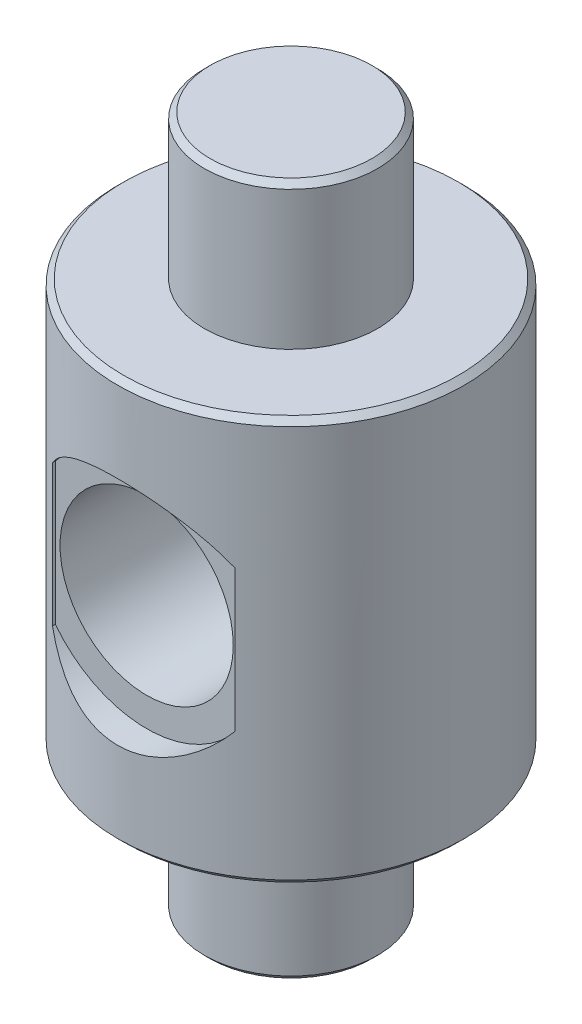
ISO-10303-21;
HEADER;
FILE_DESCRIPTION(('STEP AP214'),'2;1');
FILE_NAME('part.step','',(''),(''),'','','');
FILE_SCHEMA(('AUTOMOTIVE_DESIGN { 1 0 10303 214 1 1 1 1 }'));
ENDSEC;
DATA;
#1=APPLICATION_CONTEXT('core data for automotive mechanical design processes');
#2=APPLICATION_PROTOCOL_DEFINITION('international standard','automotive_design',2000,#1);
#3=PRODUCT_CONTEXT('',#1,'mechanical');
#4=PRODUCT('Part','Part','',(#3));
#5=PRODUCT_RELATED_PRODUCT_CATEGORY('part','',(#4));
#6=PRODUCT_DEFINITION_FORMATION('','',#4);
#7=PRODUCT_DEFINITION_CONTEXT('part definition',#1,'design');
#8=PRODUCT_DEFINITION('design','',#6,#7);
#9=PRODUCT_DEFINITION_SHAPE('','',#8);
#10=(LENGTH_UNIT() NAMED_UNIT(*) SI_UNIT(.MILLI.,.METRE.));
#11=(NAMED_UNIT(*) PLANE_ANGLE_UNIT() SI_UNIT($,.RADIAN.));
#12=(NAMED_UNIT(*) SI_UNIT($,.STERADIAN.) SOLID_ANGLE_UNIT());
#13=UNCERTAINTY_MEASURE_WITH_UNIT(LENGTH_MEASURE(1.E-05),#10,'distance_accuracy_value','');
#14=(GEOMETRIC_REPRESENTATION_CONTEXT(3) GLOBAL_UNCERTAINTY_ASSIGNED_CONTEXT((#13)) GLOBAL_UNIT_ASSIGNED_CONTEXT((#10,
#11,#12)) REPRESENTATION_CONTEXT('',''));
#15=CARTESIAN_POINT('',(0.,0.,0.));
#16=DIRECTION('',(0.,0.,1.));
#17=DIRECTION('',(1.,0.,0.));
#18=AXIS2_PLACEMENT_3D('',#15,#16,#17);
#19=CARTESIAN_POINT('',(0.,3.5,0.));
#20=DIRECTION('',(0.,-1.,0.));
#21=DIRECTION('',(0.,0.,-1.));
#22=AXIS2_PLACEMENT_3D('',#19,#20,#21);
#23=CYLINDRICAL_SURFACE('',#22,3.);
#24=CARTESIAN_POINT('',(0.,-3.4,0.));
#25=DIRECTION('',(0.,1.,0.));
#26=DIRECTION('',(0.,0.,1.));
#27=AXIS2_PLACEMENT_3D('',#24,#25,#26);
#28=CIRCLE('',#27,3.);
#29=CARTESIAN_POINT('',(0.,-3.4,3.));
#30=VERTEX_POINT('',#29);
#31=EDGE_CURVE('E222',#30,#30,#28,.T.);
#32=ORIENTED_EDGE('',*,*,#31,.T.);
#33=EDGE_LOOP('',(#32));
#34=FACE_BOUND('',#33,.T.);
#35=CARTESIAN_POINT('',(0.,3.4,0.));
#36=DIRECTION('',(0.,1.,0.));
#37=DIRECTION('',(0.,0.,1.));
#38=AXIS2_PLACEMENT_3D('',#35,#36,#37);
#39=CIRCLE('',#38,3.);
#40=CARTESIAN_POINT('',(0.,3.4,-3.));
#41=VERTEX_POINT('',#40);
#42=EDGE_CURVE('E226',#41,#41,#39,.F.);
#43=ORIENTED_EDGE('',*,*,#42,.T.);
#44=EDGE_LOOP('',(#43));
#45=FACE_BOUND('',#44,.T.);
#46=DIRECTION('',(0.,-1.,0.));
#47=VECTOR('',#46,1.);
#48=CARTESIAN_POINT('',(1.58145700431185,3.5,2.549312406025));
#49=LINE('',#48,#47);
#50=CARTESIAN_POINT('',(1.58145700431185,-1.22433399998243,2.549312406025));
#51=VERTEX_POINT('',#50);
#52=CARTESIAN_POINT('',(1.58145700431185,1.22433399998243,2.549312406025));
#53=VERTEX_POINT('',#52);
#54=EDGE_CURVE('E229',#51,#53,#49,.F.);
#55=ORIENTED_EDGE('',*,*,#54,.F.);
#56=CARTESIAN_POINT('',(1.58145700431185,-1.22433399998243,2.549312406025));
#57=CARTESIAN_POINT('',(1.54682556850329,-1.26905046882896,2.57079701537952));
#58=CARTESIAN_POINT('',(1.51036667300085,-1.31223999737416,2.59243482445627));
#59=CARTESIAN_POINT('',(1.43385097178377,-1.39544951103376,2.63552677301982));
#60=CARTESIAN_POINT('',(1.39379234019112,-1.43546786806224,2.65698081318248));
#61=CARTESIAN_POINT('',(1.26772958957034,-1.55110300532381,2.72061528811525));
#62=CARTESIAN_POINT('',(1.17636152917721,-1.621622564197,2.76172967014148));
#63=CARTESIAN_POINT('',(0.980393904844763,-1.74711699185225,2.8372350745841));
#64=CARTESIAN_POINT('',(0.875742974165186,-1.80202867904471,2.8715986006667));
#65=CARTESIAN_POINT('',(0.656114969860568,-1.89302366683344,2.92955747969777));
#66=CARTESIAN_POINT('',(0.541180189702668,-1.92918027229269,2.95319471065037));
#67=CARTESIAN_POINT('',(0.319544611235103,-1.97714507948052,2.98476540223795));
#68=CARTESIAN_POINT('',(0.213607755014206,-1.99142989158149,2.99429122726524));
#69=CARTESIAN_POINT('',(0.000355158746854033,-2.00284349309578,3.00189254845444));
#70=CARTESIAN_POINT('',(-0.106960590231578,-1.9999721713218,2.99996797040736));
#71=CARTESIAN_POINT('',(-0.306607543469042,-1.97860892479117,2.98577379457322));
#72=CARTESIAN_POINT('',(-0.399234818191251,-1.96196449176591,2.97472803914838));
#73=CARTESIAN_POINT('',(-0.580023446107977,-1.91631518510482,2.94482036019719));
#74=CARTESIAN_POINT('',(-0.668185383323556,-1.88731193257282,2.92595946179051));
#75=CARTESIAN_POINT('',(-0.842006529158818,-1.81665046952535,2.88087582193554));
#76=CARTESIAN_POINT('',(-0.927385539624844,-1.77449218566186,2.85436600964876));
#77=CARTESIAN_POINT('',(-1.09011912785783,-1.67944396554604,2.7962689052233));
#78=CARTESIAN_POINT('',(-1.16746558239865,-1.62654332237177,2.76467655389042));
#79=CARTESIAN_POINT('',(-1.3044076906707,-1.51828831679458,2.70249251907458));
#80=CARTESIAN_POINT('',(-1.36501856698581,-1.46400840104752,2.67224361772993));
#81=CARTESIAN_POINT('',(-1.47881198662576,-1.34893099262961,2.61099664236225));
#82=CARTESIAN_POINT('',(-1.53201871176459,-1.28815592056273,2.58000141443293));
#83=CARTESIAN_POINT('',(-1.58145700431185,-1.22433399998243,2.549312406025));
#84=B_SPLINE_CURVE_WITH_KNOTS('',3,(#56,#57,#58,#59,#60,#61,#62,#63,#64,#65,#66,#67,#68,#69,#70,
#71,#72,#73,#74,#75,#76,#77,#78,#79,#80,#81,#82,#83),.UNSPECIFIED.,.F.,.F.,(4,2,2,2,2,2,2,2,2,2,
2,2,2,4),(0.,0.181401404479696,0.36289534541761,0.728612432608602,1.09578953921052,
1.46152049800956,1.78158268736794,2.10164695102162,2.38464536514129,2.66760666983787,
2.96300162348525,3.25869245559962,3.51854604156222,3.77752996523963),.UNSPECIFIED.);
#85=CARTESIAN_POINT('',(-1.58145700431185,-1.22433399998243,2.549312406025));
#86=VERTEX_POINT('',#85);
#87=EDGE_CURVE('E162',#51,#86,#84,.T.);
#88=ORIENTED_EDGE('',*,*,#87,.T.);
#89=DIRECTION('',(0.,-1.,0.));
#90=VECTOR('',#89,1.);
#91=CARTESIAN_POINT('',(-1.58145700431185,3.5,2.549312406025));
#92=LINE('',#91,#90);
#93=CARTESIAN_POINT('',(-1.58145700431185,1.22433399998243,2.549312406025));
#94=VERTEX_POINT('',#93);
#95=EDGE_CURVE('E284',#86,#94,#92,.F.);
#96=ORIENTED_EDGE('',*,*,#95,.T.);
#97=CARTESIAN_POINT('',(-1.58145700431185,1.22433399998243,2.549312406025));
#98=CARTESIAN_POINT('',(-1.54682556850329,1.26905046882896,2.57079701537952));
#99=CARTESIAN_POINT('',(-1.51036667300085,1.31223999737416,2.59243482445627));
#100=CARTESIAN_POINT('',(-1.43385097178377,1.39544951103376,2.63552677301982));
#101=CARTESIAN_POINT('',(-1.39379234019112,1.43546786806224,2.65698081318248));
#102=CARTESIAN_POINT('',(-1.26772958957034,1.55110300532381,2.72061528811525));
#103=CARTESIAN_POINT('',(-1.17636152917721,1.621622564197,2.76172967014148));
#104=CARTESIAN_POINT('',(-0.980393904844763,1.74711699185225,2.8372350745841));
#105=CARTESIAN_POINT('',(-0.875742974165186,1.80202867904471,2.8715986006667));
#106=CARTESIAN_POINT('',(-0.656114969860568,1.89302366683344,2.92955747969777));
#107=CARTESIAN_POINT('',(-0.541180189702668,1.92918027229269,2.95319471065037));
#108=CARTESIAN_POINT('',(-0.319544611235103,1.97714507948052,2.98476540223795));
#109=CARTESIAN_POINT('',(-0.213607755014206,1.99142989158149,2.99429122726524));
#110=CARTESIAN_POINT('',(-0.000355158746853938,2.00284349309578,3.00189254845444));
#111=CARTESIAN_POINT('',(0.106960590231578,1.9999721713218,2.99996797040736));
#112=CARTESIAN_POINT('',(0.306607543469042,1.97860892479117,2.98577379457322));
#113=CARTESIAN_POINT('',(0.399234818191251,1.96196449176591,2.97472803914838));
#114=CARTESIAN_POINT('',(0.580023446107977,1.91631518510482,2.94482036019719));
#115=CARTESIAN_POINT('',(0.668185383323556,1.88731193257282,2.92595946179051));
#116=CARTESIAN_POINT('',(0.842006529158818,1.81665046952535,2.88087582193554));
#117=CARTESIAN_POINT('',(0.927385539624844,1.77449218566186,2.85436600964876));
#118=CARTESIAN_POINT('',(1.09011912785783,1.67944396554604,2.7962689052233));
#119=CARTESIAN_POINT('',(1.16746558239865,1.62654332237177,2.76467655389042));
#120=CARTESIAN_POINT('',(1.3044076906707,1.51828831679458,2.70249251907458));
#121=CARTESIAN_POINT('',(1.36501856698581,1.46400840104752,2.67224361772993));
#122=CARTESIAN_POINT('',(1.47881198662576,1.34893099262961,2.61099664236225));
#123=CARTESIAN_POINT('',(1.53201871176459,1.28815592056273,2.58000141443293));
#124=CARTESIAN_POINT('',(1.58145700431185,1.22433399998243,2.549312406025));
#125=B_SPLINE_CURVE_WITH_KNOTS('',3,(#97,#98,#99,#100,#101,#102,#103,#104,#105,#106,#107,#108,
#109,#110,#111,#112,#113,#114,#115,#116,#117,#118,#119,#120,#121,#122,#123,#124),.UNSPECIFIED.,
.F.,.F.,(4,2,2,2,2,2,2,2,2,2,2,2,2,4),(0.,0.181401404479696,0.36289534541761,0.728612432608602,
1.09578953921052,1.46152049800956,1.78158268736794,2.10164695102162,2.38464536514129,
2.66760666983787,2.96300162348525,3.25869245559961,3.51854604156222,3.77752996523963),.UNSPECIFIED.);
#126=EDGE_CURVE('E59',#94,#53,#125,.T.);
#127=ORIENTED_EDGE('',*,*,#126,.T.);
#128=EDGE_LOOP('',(#55,#88,#96,#127));
#129=FACE_BOUND('',#128,.T.);
#130=CARTESIAN_POINT('',(1.58145700431185,-1.22433399998243,-2.549312406025));
#131=CARTESIAN_POINT('',(1.5468255685033,-1.26905046882896,-2.57079701537952));
#132=CARTESIAN_POINT('',(1.51036667300085,-1.31223999737416,-2.59243482445627));
#133=CARTESIAN_POINT('',(1.43385097178377,-1.39544951103375,-2.63552677301982));
#134=CARTESIAN_POINT('',(1.39379234019112,-1.43546786806224,-2.65698081318248));
#135=CARTESIAN_POINT('',(1.26772958957034,-1.55110300532381,-2.72061528811525));
#136=CARTESIAN_POINT('',(1.17636152917721,-1.621622564197,-2.76172967014148));
#137=CARTESIAN_POINT('',(0.980393904844763,-1.74711699185225,-2.8372350745841));
#138=CARTESIAN_POINT('',(0.875742974165186,-1.80202867904471,-2.8715986006667));
#139=CARTESIAN_POINT('',(0.656114969860568,-1.89302366683344,-2.92955747969777));
#140=CARTESIAN_POINT('',(0.541180189702669,-1.92918027229269,-2.95319471065037));
#141=CARTESIAN_POINT('',(0.319544611235103,-1.97714507948052,-2.98476540223795));
#142=CARTESIAN_POINT('',(0.213607755014206,-1.99142989158149,-2.99429122726524));
#143=CARTESIAN_POINT('',(0.000355158746854603,-2.00284349309578,-3.00189254845444));
#144=CARTESIAN_POINT('',(-0.106960590231577,-1.9999721713218,-2.99996797040736));
#145=CARTESIAN_POINT('',(-0.306607543469041,-1.97860892479117,-2.98577379457322));
#146=CARTESIAN_POINT('',(-0.39923481819125,-1.96196449176591,-2.97472803914838));
#147=CARTESIAN_POINT('',(-0.580023446107976,-1.91631518510482,-2.9448203601972));
#148=CARTESIAN_POINT('',(-0.668185383323555,-1.88731193257282,-2.92595946179051));
#149=CARTESIAN_POINT('',(-0.842006529158818,-1.81665046952535,-2.88087582193554));
#150=CARTESIAN_POINT('',(-0.927385539624844,-1.77449218566186,-2.85436600964876));
#151=CARTESIAN_POINT('',(-1.09011912785783,-1.67944396554604,-2.7962689052233));
#152=CARTESIAN_POINT('',(-1.16746558239865,-1.62654332237177,-2.76467655389042));
#153=CARTESIAN_POINT('',(-1.3044076906707,-1.51828831679458,-2.70249251907458));
#154=CARTESIAN_POINT('',(-1.36501856698581,-1.46400840104752,-2.67224361772993));
#155=CARTESIAN_POINT('',(-1.47881198662576,-1.34893099262961,-2.61099664236225));
#156=CARTESIAN_POINT('',(-1.53201871176459,-1.28815592056273,-2.58000141443293));
#157=CARTESIAN_POINT('',(-1.58145700431185,-1.22433399998243,-2.549312406025));
#158=B_SPLINE_CURVE_WITH_KNOTS('',3,(#130,#131,#132,#133,#134,#135,#136,#137,#138,#139,#140,
#141,#142,#143,#144,#145,#146,#147,#148,#149,#150,#151,#152,#153,#154,#155,#156,#157),
.UNSPECIFIED.,.F.,.F.,(4,2,2,2,2,2,2,2,2,2,2,2,2,4),(0.,0.181401404479696,0.36289534541761,
0.728612432608602,1.09578953921052,1.46152049800956,1.78158268736794,2.10164695102162,
2.38464536514129,2.66760666983787,2.96300162348525,3.25869245559962,3.51854604156222,
3.77752996523963),.UNSPECIFIED.);
#159=CARTESIAN_POINT('',(1.58145700431185,-1.22433399998243,-2.549312406025));
#160=VERTEX_POINT('',#159);
#161=CARTESIAN_POINT('',(-1.58145700431185,-1.22433399998243,-2.549312406025));
#162=VERTEX_POINT('',#161);
#163=EDGE_CURVE('E231',#160,#162,#158,.T.);
#164=ORIENTED_EDGE('',*,*,#163,.F.);
#165=DIRECTION('',(0.,-1.,0.));
#166=VECTOR('',#165,1.);
#167=CARTESIAN_POINT('',(1.58145700431185,3.5,-2.549312406025));
#168=LINE('',#167,#166);
#169=CARTESIAN_POINT('',(1.58145700431185,1.22433399998243,-2.549312406025));
#170=VERTEX_POINT('',#169);
#171=EDGE_CURVE('E233',#160,#170,#168,.F.);
#172=ORIENTED_EDGE('',*,*,#171,.T.);
#173=CARTESIAN_POINT('',(-1.58145700431185,1.22433399998243,-2.549312406025));
#174=CARTESIAN_POINT('',(-1.54682556850329,1.26905046882896,-2.57079701537952));
#175=CARTESIAN_POINT('',(-1.51036667300085,1.31223999737416,-2.59243482445627));
#176=CARTESIAN_POINT('',(-1.43385097178377,1.39544951103376,-2.63552677301982));
#177=CARTESIAN_POINT('',(-1.39379234019112,1.43546786806224,-2.65698081318248));
#178=CARTESIAN_POINT('',(-1.26772958957034,1.55110300532381,-2.72061528811525));
#179=CARTESIAN_POINT('',(-1.17636152917721,1.621622564197,-2.76172967014148));
#180=CARTESIAN_POINT('',(-0.980393904844763,1.74711699185225,-2.8372350745841));
#181=CARTESIAN_POINT('',(-0.875742974165186,1.80202867904471,-2.8715986006667));
#182=CARTESIAN_POINT('',(-0.656114969860568,1.89302366683344,-2.92955747969777));
#183=CARTESIAN_POINT('',(-0.541180189702668,1.92918027229269,-2.95319471065037));
#184=CARTESIAN_POINT('',(-0.319544611235103,1.97714507948052,-2.98476540223795));
#185=CARTESIAN_POINT('',(-0.213607755014206,1.99142989158149,-2.99429122726524));
#186=CARTESIAN_POINT('',(-0.000355158746853938,2.00284349309578,-3.00189254845444));
#187=CARTESIAN_POINT('',(0.106960590231578,1.9999721713218,-2.99996797040736));
#188=CARTESIAN_POINT('',(0.306607543469042,1.97860892479117,-2.98577379457322));
#189=CARTESIAN_POINT('',(0.399234818191251,1.96196449176591,-2.97472803914838));
#190=CARTESIAN_POINT('',(0.580023446107977,1.91631518510482,-2.94482036019719));
#191=CARTESIAN_POINT('',(0.668185383323556,1.88731193257282,-2.92595946179051));
#192=CARTESIAN_POINT('',(0.842006529158818,1.81665046952535,-2.88087582193554));
#193=CARTESIAN_POINT('',(0.927385539624844,1.77449218566186,-2.85436600964876));
#194=CARTESIAN_POINT('',(1.09011912785783,1.67944396554604,-2.7962689052233));
#195=CARTESIAN_POINT('',(1.16746558239865,1.62654332237177,-2.76467655389042));
#196=CARTESIAN_POINT('',(1.3044076906707,1.51828831679458,-2.70249251907458));
#197=CARTESIAN_POINT('',(1.36501856698581,1.46400840104752,-2.67224361772993));
#198=CARTESIAN_POINT('',(1.47881198662576,1.34893099262961,-2.61099664236225));
#199=CARTESIAN_POINT('',(1.53201871176459,1.28815592056273,-2.58000141443293));
#200=CARTESIAN_POINT('',(1.58145700431185,1.22433399998243,-2.549312406025));
#201=B_SPLINE_CURVE_WITH_KNOTS('',3,(#173,#174,#175,#176,#177,#178,#179,#180,#181,#182,#183,
#184,#185,#186,#187,#188,#189,#190,#191,#192,#193,#194,#195,#196,#197,#198,#199,#200),
.UNSPECIFIED.,.F.,.F.,(4,2,2,2,2,2,2,2,2,2,2,2,2,4),(0.,0.181401404479696,0.36289534541761,
0.728612432608602,1.09578953921052,1.46152049800956,1.78158268736794,2.10164695102162,
2.38464536514129,2.66760666983787,2.96300162348525,3.25869245559961,3.51854604156222,
3.77752996523963),.UNSPECIFIED.);
#202=CARTESIAN_POINT('',(-1.58145700431185,1.22433399998243,-2.549312406025));
#203=VERTEX_POINT('',#202);
#204=EDGE_CURVE('E240',#203,#170,#201,.T.);
#205=ORIENTED_EDGE('',*,*,#204,.F.);
#206=DIRECTION('',(0.,-1.,0.));
#207=VECTOR('',#206,1.);
#208=CARTESIAN_POINT('',(-1.58145700431185,3.5,-2.549312406025));
#209=LINE('',#208,#207);
#210=EDGE_CURVE('E122',#162,#203,#209,.F.);
#211=ORIENTED_EDGE('',*,*,#210,.F.);
#212=EDGE_LOOP('',(#164,#172,#205,#211));
#213=FACE_BOUND('',#212,.T.);
#214=ADVANCED_FACE('F35',(#34,#45,#129,#213),#23,.T.);
#215=CARTESIAN_POINT('',(0.,0.,-3.));
#216=DIRECTION('',(0.,0.,1.));
#217=DIRECTION('',(1.,0.,0.));
#218=AXIS2_PLACEMENT_3D('',#215,#216,#217);
#219=CYLINDRICAL_SURFACE('',#218,1.5);
#220=CARTESIAN_POINT('',(0.,0.,2.5));
#221=DIRECTION('',(0.,0.,1.));
#222=DIRECTION('',(1.,0.,0.));
#223=AXIS2_PLACEMENT_3D('',#220,#221,#222);
#224=CIRCLE('',#223,1.5);
#225=CARTESIAN_POINT('',(1.5,0.,2.5));
#226=VERTEX_POINT('',#225);
#227=EDGE_CURVE('E142',#226,#226,#224,.T.);
#228=ORIENTED_EDGE('',*,*,#227,.T.);
#229=EDGE_LOOP('',(#228));
#230=FACE_BOUND('',#229,.T.);
#231=CARTESIAN_POINT('',(0.,0.,-2.5));
#232=DIRECTION('',(0.,0.,-1.));
#233=DIRECTION('',(-1.,0.,0.));
#234=AXIS2_PLACEMENT_3D('',#231,#232,#233);
#235=CIRCLE('',#234,1.5);
#236=CARTESIAN_POINT('',(-1.5,0.,-2.5));
#237=VERTEX_POINT('',#236);
#238=EDGE_CURVE('E133',#237,#237,#235,.F.);
#239=ORIENTED_EDGE('',*,*,#238,.F.);
#240=EDGE_LOOP('',(#239));
#241=FACE_BOUND('',#240,.T.);
#242=ADVANCED_FACE('F211',(#230,#241),#219,.F.);
#243=CARTESIAN_POINT('',(0.,6.,0.));
#244=DIRECTION('',(0.,-1.,0.));
#245=DIRECTION('',(0.,0.,-1.));
#246=AXIS2_PLACEMENT_3D('',#243,#244,#245);
#247=CYLINDRICAL_SURFACE('',#246,1.5);
#248=CARTESIAN_POINT('',(0.,5.9,0.));
#249=DIRECTION('',(0.,1.,0.));
#250=DIRECTION('',(0.,0.,1.));
#251=AXIS2_PLACEMENT_3D('',#248,#249,#250);
#252=CIRCLE('',#251,1.5);
#253=CARTESIAN_POINT('',(0.,5.9,1.5));
#254=VERTEX_POINT('',#253);
#255=EDGE_CURVE('E334',#254,#254,#252,.F.);
#256=ORIENTED_EDGE('',*,*,#255,.T.);
#257=EDGE_LOOP('',(#256));
#258=FACE_BOUND('',#257,.T.);
#259=CARTESIAN_POINT('',(0.,3.5,0.));
#260=DIRECTION('',(0.,1.,0.));
#261=DIRECTION('',(0.,0.,1.));
#262=AXIS2_PLACEMENT_3D('',#259,#260,#261);
#263=CIRCLE('',#262,1.5);
#264=CARTESIAN_POINT('',(0.,3.5,1.5));
#265=VERTEX_POINT('',#264);
#266=EDGE_CURVE('E152',#265,#265,#263,.T.);
#267=ORIENTED_EDGE('',*,*,#266,.T.);
#268=EDGE_LOOP('',(#267));
#269=FACE_BOUND('',#268,.T.);
#270=ADVANCED_FACE('F216',(#258,#269),#247,.T.);
#271=CARTESIAN_POINT('',(0.,6.,0.));
#272=DIRECTION('',(0.,1.,0.));
#273=DIRECTION('',(0.,0.,1.));
#274=AXIS2_PLACEMENT_3D('',#271,#272,#273);
#275=PLANE('',#274);
#276=CARTESIAN_POINT('',(0.,6.,0.));
#277=DIRECTION('',(0.,1.,0.));
#278=DIRECTION('',(0.,0.,1.));
#279=AXIS2_PLACEMENT_3D('',#276,#277,#278);
#280=CIRCLE('',#279,1.4);
#281=CARTESIAN_POINT('',(0.,6.,1.4));
#282=VERTEX_POINT('',#281);
#283=EDGE_CURVE('E239',#282,#282,#280,.T.);
#284=ORIENTED_EDGE('',*,*,#283,.T.);
#285=EDGE_LOOP('',(#284));
#286=FACE_BOUND('',#285,.T.);
#287=ADVANCED_FACE('F198',(#286),#275,.T.);
#288=CARTESIAN_POINT('',(0.,3.5,0.));
#289=DIRECTION('',(0.,1.,0.));
#290=DIRECTION('',(0.,0.,1.));
#291=AXIS2_PLACEMENT_3D('',#288,#289,#290);
#292=PLANE('',#291);
#293=CARTESIAN_POINT('',(0.,3.5,0.));
#294=DIRECTION('',(0.,1.,0.));
#295=DIRECTION('',(0.,0.,1.));
#296=AXIS2_PLACEMENT_3D('',#293,#294,#295);
#297=CIRCLE('',#296,2.9);
#298=CARTESIAN_POINT('',(0.,3.5,-2.9));
#299=VERTEX_POINT('',#298);
#300=EDGE_CURVE('E11',#299,#299,#297,.T.);
#301=ORIENTED_EDGE('',*,*,#300,.T.);
#302=EDGE_LOOP('',(#301));
#303=FACE_BOUND('',#302,.T.);
#304=ORIENTED_EDGE('',*,*,#266,.F.);
#305=EDGE_LOOP('',(#304));
#306=FACE_BOUND('',#305,.T.);
#307=ADVANCED_FACE('F195',(#303,#306),#292,.T.);
#308=CARTESIAN_POINT('',(0.,-3.5,0.));
#309=DIRECTION('',(0.,1.,0.));
#310=DIRECTION('',(0.,0.,1.));
#311=AXIS2_PLACEMENT_3D('',#308,#309,#310);
#312=PLANE('',#311);
#313=CARTESIAN_POINT('',(0.,-3.5,0.));
#314=DIRECTION('',(0.,1.,0.));
#315=DIRECTION('',(0.,0.,1.));
#316=AXIS2_PLACEMENT_3D('',#313,#314,#315);
#317=CIRCLE('',#316,2.9);
#318=CARTESIAN_POINT('',(0.,-3.5,2.9));
#319=VERTEX_POINT('',#318);
#320=EDGE_CURVE('E44',#319,#319,#317,.F.);
#321=ORIENTED_EDGE('',*,*,#320,.T.);
#322=EDGE_LOOP('',(#321));
#323=FACE_BOUND('',#322,.T.);
#324=CARTESIAN_POINT('',(0.,-3.5,0.));
#325=DIRECTION('',(0.,1.,0.));
#326=DIRECTION('',(0.,0.,1.));
#327=AXIS2_PLACEMENT_3D('',#324,#325,#326);
#328=CIRCLE('',#327,1.5);
#329=CARTESIAN_POINT('',(0.,-3.5,1.5));
#330=VERTEX_POINT('',#329);
#331=EDGE_CURVE('E159',#330,#330,#328,.T.);
#332=ORIENTED_EDGE('',*,*,#331,.T.);
#333=EDGE_LOOP('',(#332));
#334=FACE_BOUND('',#333,.T.);
#335=ADVANCED_FACE('F197',(#323,#334),#312,.F.);
#336=CARTESIAN_POINT('',(0.,-6.,0.));
#337=DIRECTION('',(0.,1.,0.));
#338=DIRECTION('',(0.,0.,1.));
#339=AXIS2_PLACEMENT_3D('',#336,#337,#338);
#340=PLANE('',#339);
#341=CARTESIAN_POINT('',(0.,-6.,0.));
#342=DIRECTION('',(0.,1.,0.));
#343=DIRECTION('',(0.,0.,1.));
#344=AXIS2_PLACEMENT_3D('',#341,#342,#343);
#345=CIRCLE('',#344,1.4);
#346=CARTESIAN_POINT('',(0.,-6.,1.4));
#347=VERTEX_POINT('',#346);
#348=EDGE_CURVE('E326',#347,#347,#345,.F.);
#349=ORIENTED_EDGE('',*,*,#348,.T.);
#350=EDGE_LOOP('',(#349));
#351=FACE_BOUND('',#350,.T.);
#352=ADVANCED_FACE('F201',(#351),#340,.F.);
#353=CARTESIAN_POINT('',(0.,-5.9,0.));
#354=DIRECTION('',(0.,1.,0.));
#355=DIRECTION('',(0.,0.,1.));
#356=AXIS2_PLACEMENT_3D('',#353,#354,#355);
#357=CIRCLE('',#356,1.5);
#358=CARTESIAN_POINT('',(0.,-5.9,1.5));
#359=VERTEX_POINT('',#358);
#360=EDGE_CURVE('E331',#359,#359,#357,.T.);
#361=ORIENTED_EDGE('',*,*,#360,.T.);
#362=EDGE_LOOP('',(#361));
#363=FACE_BOUND('',#362,.T.);
#364=ORIENTED_EDGE('',*,*,#331,.F.);
#365=EDGE_LOOP('',(#364));
#366=FACE_BOUND('',#365,.T.);
#367=ADVANCED_FACE('F193',(#363,#366),#247,.T.);
#368=CARTESIAN_POINT('',(-1.58145700431185,1.22433399998243,2.5));
#369=DIRECTION('',(-1.,0.,0.));
#370=DIRECTION('',(0.,0.,1.));
#371=AXIS2_PLACEMENT_3D('',#368,#369,#370);
#372=PLANE('',#371);
#373=DIRECTION('',(0.,0.,1.));
#374=VECTOR('',#373,1.);
#375=CARTESIAN_POINT('',(-1.58145700431185,-1.22433399998243,2.5));
#376=LINE('',#375,#374);
#377=CARTESIAN_POINT('',(-1.58145700431185,-1.22433399998243,2.5));
#378=VERTEX_POINT('',#377);
#379=EDGE_CURVE('E51',#378,#86,#376,.T.);
#380=ORIENTED_EDGE('',*,*,#379,.F.);
#381=DIRECTION('',(0.,-1.,0.));
#382=VECTOR('',#381,1.);
#383=CARTESIAN_POINT('',(-1.58145700431185,1.22433399998243,2.5));
#384=LINE('',#383,#382);
#385=CARTESIAN_POINT('',(-1.58145700431185,1.22433399998243,2.5));
#386=VERTEX_POINT('',#385);
#387=EDGE_CURVE('E138',#386,#378,#384,.T.);
#388=ORIENTED_EDGE('',*,*,#387,.F.);
#389=DIRECTION('',(0.,0.,1.));
#390=VECTOR('',#389,1.);
#391=CARTESIAN_POINT('',(-1.58145700431185,1.22433399998243,2.5));
#392=LINE('',#391,#390);
#393=EDGE_CURVE('E150',#386,#94,#392,.T.);
#394=ORIENTED_EDGE('',*,*,#393,.T.);
#395=ORIENTED_EDGE('',*,*,#95,.F.);
#396=EDGE_LOOP('',(#380,#388,#394,#395));
#397=FACE_BOUND('',#396,.T.);
#398=ADVANCED_FACE('F189',(#397),#372,.F.);
#399=CARTESIAN_POINT('',(0.,0.,2.5));
#400=DIRECTION('',(0.,0.,1.));
#401=DIRECTION('',(1.,0.,0.));
#402=AXIS2_PLACEMENT_3D('',#399,#400,#401);
#403=CYLINDRICAL_SURFACE('',#402,2.);
#404=ORIENTED_EDGE('',*,*,#393,.F.);
#405=CARTESIAN_POINT('',(0.,0.,2.5));
#406=DIRECTION('',(0.,0.,1.));
#407=DIRECTION('',(1.,0.,0.));
#408=AXIS2_PLACEMENT_3D('',#405,#406,#407);
#409=CIRCLE('',#408,2.);
#410=CARTESIAN_POINT('',(1.58145700431185,1.22433399998243,2.5));
#411=VERTEX_POINT('',#410);
#412=EDGE_CURVE('E147',#411,#386,#409,.T.);
#413=ORIENTED_EDGE('',*,*,#412,.F.);
#414=DIRECTION('',(0.,0.,1.));
#415=VECTOR('',#414,1.);
#416=CARTESIAN_POINT('',(1.58145700431185,1.22433399998243,2.5));
#417=LINE('',#416,#415);
#418=EDGE_CURVE('E153',#411,#53,#417,.T.);
#419=ORIENTED_EDGE('',*,*,#418,.T.);
#420=ORIENTED_EDGE('',*,*,#126,.F.);
#421=EDGE_LOOP('',(#404,#413,#419,#420));
#422=FACE_BOUND('',#421,.T.);
#423=ADVANCED_FACE('F192',(#422),#403,.F.);
#424=CARTESIAN_POINT('',(1.58145700431185,1.22433399998243,2.5));
#425=DIRECTION('',(-1.,0.,0.));
#426=DIRECTION('',(0.,0.,1.));
#427=AXIS2_PLACEMENT_3D('',#424,#425,#426);
#428=PLANE('',#427);
#429=ORIENTED_EDGE('',*,*,#54,.T.);
#430=ORIENTED_EDGE('',*,*,#418,.F.);
#431=DIRECTION('',(0.,-1.,0.));
#432=VECTOR('',#431,1.);
#433=CARTESIAN_POINT('',(1.58145700431185,1.22433399998243,2.5));
#434=LINE('',#433,#432);
#435=CARTESIAN_POINT('',(1.58145700431185,-1.22433399998243,2.5));
#436=VERTEX_POINT('',#435);
#437=EDGE_CURVE('E145',#411,#436,#434,.T.);
#438=ORIENTED_EDGE('',*,*,#437,.T.);
#439=DIRECTION('',(0.,0.,1.));
#440=VECTOR('',#439,1.);
#441=CARTESIAN_POINT('',(1.58145700431185,-1.22433399998243,2.5));
#442=LINE('',#441,#440);
#443=EDGE_CURVE('E155',#436,#51,#442,.T.);
#444=ORIENTED_EDGE('',*,*,#443,.T.);
#445=EDGE_LOOP('',(#429,#430,#438,#444));
#446=FACE_BOUND('',#445,.T.);
#447=ADVANCED_FACE('F188',(#446),#428,.T.);
#448=CARTESIAN_POINT('',(0.,0.,2.5));
#449=DIRECTION('',(0.,0.,1.));
#450=DIRECTION('',(1.,0.,0.));
#451=AXIS2_PLACEMENT_3D('',#448,#449,#450);
#452=CYLINDRICAL_SURFACE('',#451,2.);
#453=ORIENTED_EDGE('',*,*,#443,.F.);
#454=CARTESIAN_POINT('',(0.,0.,2.5));
#455=DIRECTION('',(0.,0.,1.));
#456=DIRECTION('',(1.,0.,0.));
#457=AXIS2_PLACEMENT_3D('',#454,#455,#456);
#458=CIRCLE('',#457,2.);
#459=EDGE_CURVE('E141',#378,#436,#458,.T.);
#460=ORIENTED_EDGE('',*,*,#459,.F.);
#461=ORIENTED_EDGE('',*,*,#379,.T.);
#462=ORIENTED_EDGE('',*,*,#87,.F.);
#463=EDGE_LOOP('',(#453,#460,#461,#462));
#464=FACE_BOUND('',#463,.T.);
#465=ADVANCED_FACE('F182',(#464),#452,.F.);
#466=CARTESIAN_POINT('',(0.,0.,2.5));
#467=DIRECTION('',(0.,0.,1.));
#468=DIRECTION('',(1.,0.,0.));
#469=AXIS2_PLACEMENT_3D('',#466,#467,#468);
#470=PLANE('',#469);
#471=ORIENTED_EDGE('',*,*,#227,.F.);
#472=EDGE_LOOP('',(#471));
#473=FACE_BOUND('',#472,.T.);
#474=ORIENTED_EDGE('',*,*,#387,.T.);
#475=ORIENTED_EDGE('',*,*,#459,.T.);
#476=ORIENTED_EDGE('',*,*,#437,.F.);
#477=ORIENTED_EDGE('',*,*,#412,.T.);
#478=EDGE_LOOP('',(#474,#475,#476,#477));
#479=FACE_BOUND('',#478,.T.);
#480=ADVANCED_FACE('F187',(#473,#479),#470,.T.);
#481=CARTESIAN_POINT('',(-1.58145700431185,1.22433399998243,-2.5));
#482=DIRECTION('',(1.,0.,0.));
#483=DIRECTION('',(0.,0.,-1.));
#484=AXIS2_PLACEMENT_3D('',#481,#482,#483);
#485=PLANE('',#484);
#486=ORIENTED_EDGE('',*,*,#210,.T.);
#487=DIRECTION('',(0.,0.,-1.));
#488=VECTOR('',#487,1.);
#489=CARTESIAN_POINT('',(-1.58145700431185,1.22433399998243,-2.5));
#490=LINE('',#489,#488);
#491=CARTESIAN_POINT('',(-1.58145700431185,1.22433399998243,-2.5));
#492=VERTEX_POINT('',#491);
#493=EDGE_CURVE('E105',#492,#203,#490,.T.);
#494=ORIENTED_EDGE('',*,*,#493,.F.);
#495=DIRECTION('',(0.,-1.,0.));
#496=VECTOR('',#495,1.);
#497=CARTESIAN_POINT('',(-1.58145700431185,1.22433399998243,-2.5));
#498=LINE('',#497,#496);
#499=CARTESIAN_POINT('',(-1.58145700431185,-1.22433399998243,-2.5));
#500=VERTEX_POINT('',#499);
#501=EDGE_CURVE('E114',#492,#500,#498,.T.);
#502=ORIENTED_EDGE('',*,*,#501,.T.);
#503=DIRECTION('',(0.,0.,-1.));
#504=VECTOR('',#503,1.);
#505=CARTESIAN_POINT('',(-1.58145700431185,-1.22433399998243,-2.5));
#506=LINE('',#505,#504);
#507=EDGE_CURVE('E131',#500,#162,#506,.T.);
#508=ORIENTED_EDGE('',*,*,#507,.T.);
#509=EDGE_LOOP('',(#486,#494,#502,#508));
#510=FACE_BOUND('',#509,.T.);
#511=ADVANCED_FACE('F118',(#510),#485,.T.);
#512=CARTESIAN_POINT('',(0.,0.,-2.5));
#513=DIRECTION('',(0.,0.,-1.));
#514=DIRECTION('',(-1.,0.,0.));
#515=AXIS2_PLACEMENT_3D('',#512,#513,#514);
#516=CYLINDRICAL_SURFACE('',#515,2.);
#517=DIRECTION('',(0.,0.,-1.));
#518=VECTOR('',#517,1.);
#519=CARTESIAN_POINT('',(1.58145700431185,-1.22433399998243,-2.5));
#520=LINE('',#519,#518);
#521=CARTESIAN_POINT('',(1.58145700431185,-1.22433399998243,-2.5));
#522=VERTEX_POINT('',#521);
#523=EDGE_CURVE('E134',#522,#160,#520,.T.);
#524=ORIENTED_EDGE('',*,*,#523,.T.);
#525=ORIENTED_EDGE('',*,*,#163,.T.);
#526=ORIENTED_EDGE('',*,*,#507,.F.);
#527=CARTESIAN_POINT('',(0.,0.,-2.5));
#528=DIRECTION('',(0.,0.,1.));
#529=DIRECTION('',(1.,0.,0.));
#530=AXIS2_PLACEMENT_3D('',#527,#528,#529);
#531=CIRCLE('',#530,2.);
#532=EDGE_CURVE('E123',#500,#522,#531,.T.);
#533=ORIENTED_EDGE('',*,*,#532,.T.);
#534=EDGE_LOOP('',(#524,#525,#526,#533));
#535=FACE_BOUND('',#534,.T.);
#536=ADVANCED_FACE('F242',(#535),#516,.F.);
#537=CARTESIAN_POINT('',(1.58145700431185,1.22433399998243,-2.5));
#538=DIRECTION('',(1.,0.,0.));
#539=DIRECTION('',(0.,0.,-1.));
#540=AXIS2_PLACEMENT_3D('',#537,#538,#539);
#541=PLANE('',#540);
#542=ORIENTED_EDGE('',*,*,#523,.F.);
#543=DIRECTION('',(0.,-1.,0.));
#544=VECTOR('',#543,1.);
#545=CARTESIAN_POINT('',(1.58145700431185,1.22433399998243,-2.5));
#546=LINE('',#545,#544);
#547=CARTESIAN_POINT('',(1.58145700431185,1.22433399998243,-2.5));
#548=VERTEX_POINT('',#547);
#549=EDGE_CURVE('E113',#548,#522,#546,.T.);
#550=ORIENTED_EDGE('',*,*,#549,.F.);
#551=DIRECTION('',(0.,0.,-1.));
#552=VECTOR('',#551,1.);
#553=CARTESIAN_POINT('',(1.58145700431185,1.22433399998243,-2.5));
#554=LINE('',#553,#552);
#555=EDGE_CURVE('E108',#548,#170,#554,.T.);
#556=ORIENTED_EDGE('',*,*,#555,.T.);
#557=ORIENTED_EDGE('',*,*,#171,.F.);
#558=EDGE_LOOP('',(#542,#550,#556,#557));
#559=FACE_BOUND('',#558,.T.);
#560=ADVANCED_FACE('F238',(#559),#541,.F.);
#561=CARTESIAN_POINT('',(0.,0.,-2.5));
#562=DIRECTION('',(0.,0.,-1.));
#563=DIRECTION('',(-1.,0.,0.));
#564=AXIS2_PLACEMENT_3D('',#561,#562,#563);
#565=CYLINDRICAL_SURFACE('',#564,2.);
#566=ORIENTED_EDGE('',*,*,#204,.T.);
#567=ORIENTED_EDGE('',*,*,#555,.F.);
#568=CARTESIAN_POINT('',(0.,0.,-2.5));
#569=DIRECTION('',(0.,0.,1.));
#570=DIRECTION('',(1.,0.,0.));
#571=AXIS2_PLACEMENT_3D('',#568,#569,#570);
#572=CIRCLE('',#571,2.);
#573=EDGE_CURVE('E102',#548,#492,#572,.T.);
#574=ORIENTED_EDGE('',*,*,#573,.T.);
#575=ORIENTED_EDGE('',*,*,#493,.T.);
#576=EDGE_LOOP('',(#566,#567,#574,#575));
#577=FACE_BOUND('',#576,.T.);
#578=ADVANCED_FACE('F104',(#577),#565,.F.);
#579=CARTESIAN_POINT('',(0.,0.,-2.5));
#580=DIRECTION('',(0.,0.,-1.));
#581=DIRECTION('',(1.,0.,0.));
#582=AXIS2_PLACEMENT_3D('',#579,#580,#581);
#583=PLANE('',#582);
#584=ORIENTED_EDGE('',*,*,#501,.F.);
#585=ORIENTED_EDGE('',*,*,#573,.F.);
#586=ORIENTED_EDGE('',*,*,#549,.T.);
#587=ORIENTED_EDGE('',*,*,#532,.F.);
#588=EDGE_LOOP('',(#584,#585,#586,#587));
#589=FACE_BOUND('',#588,.T.);
#590=ORIENTED_EDGE('',*,*,#238,.T.);
#591=EDGE_LOOP('',(#590));
#592=FACE_BOUND('',#591,.T.);
#593=ADVANCED_FACE('F125',(#589,#592),#583,.T.);
#594=CARTESIAN_POINT('',(0.,6.,0.));
#595=DIRECTION('',(0.,-1.,0.));
#596=DIRECTION('',(0.,0.,-1.));
#597=AXIS2_PLACEMENT_3D('',#594,#595,#596);
#598=CONICAL_SURFACE('',#597,1.4,0.785398163397448);
#599=ORIENTED_EDGE('',*,*,#255,.F.);
#600=EDGE_LOOP('',(#599));
#601=FACE_BOUND('',#600,.T.);
#602=ORIENTED_EDGE('',*,*,#283,.F.);
#603=EDGE_LOOP('',(#602));
#604=FACE_BOUND('',#603,.T.);
#605=ADVANCED_FACE('F292',(#601,#604),#598,.T.);
#606=CARTESIAN_POINT('',(0.,-5.9,0.));
#607=DIRECTION('',(0.,1.,0.));
#608=DIRECTION('',(0.,0.,1.));
#609=AXIS2_PLACEMENT_3D('',#606,#607,#608);
#610=CONICAL_SURFACE('',#609,1.5,0.785398163397452);
#611=ORIENTED_EDGE('',*,*,#348,.F.);
#612=EDGE_LOOP('',(#611));
#613=FACE_BOUND('',#612,.T.);
#614=ORIENTED_EDGE('',*,*,#360,.F.);
#615=EDGE_LOOP('',(#614));
#616=FACE_BOUND('',#615,.T.);
#617=ADVANCED_FACE('F296',(#613,#616),#610,.T.);
#618=CARTESIAN_POINT('',(0.,-3.4,0.));
#619=DIRECTION('',(0.,1.,0.));
#620=DIRECTION('',(0.,0.,1.));
#621=AXIS2_PLACEMENT_3D('',#618,#619,#620);
#622=CONICAL_SURFACE('',#621,3.,0.785398163397446);
#623=CARTESIAN_POINT('',(0.,-3.5,2.9));
#624=CARTESIAN_POINT('',(0.,-3.49895833333333,2.90104166666667));
#625=CARTESIAN_POINT('',(0.,-3.49791666666667,2.90208333333334));
#626=CARTESIAN_POINT('',(0.,-3.49583333333333,2.90416666666667));
#627=CARTESIAN_POINT('',(0.,-3.49479166666667,2.90520833333334));
#628=CARTESIAN_POINT('',(0.,-3.49270833333333,2.90729166666667));
#629=CARTESIAN_POINT('',(0.,-3.49166666666667,2.90833333333334));
#630=CARTESIAN_POINT('',(0.,-3.48958333333333,2.91041666666667));
#631=CARTESIAN_POINT('',(0.,-3.48854166666667,2.91145833333334));
#632=CARTESIAN_POINT('',(0.,-3.48645833333333,2.91354166666667));
#633=CARTESIAN_POINT('',(0.,-3.48541666666667,2.91458333333334));
#634=CARTESIAN_POINT('',(0.,-3.48333333333333,2.91666666666667));
#635=CARTESIAN_POINT('',(0.,-3.48229166666667,2.91770833333334));
#636=CARTESIAN_POINT('',(0.,-3.48020833333333,2.91979166666667));
#637=CARTESIAN_POINT('',(0.,-3.47916666666667,2.92083333333334));
#638=CARTESIAN_POINT('',(0.,-3.47708333333333,2.92291666666667));
#639=CARTESIAN_POINT('',(0.,-3.47604166666667,2.92395833333334));
#640=CARTESIAN_POINT('',(0.,-3.47395833333333,2.92604166666667));
#641=CARTESIAN_POINT('',(0.,-3.47291666666667,2.92708333333334));
#642=CARTESIAN_POINT('',(0.,-3.47083333333333,2.92916666666667));
#643=CARTESIAN_POINT('',(0.,-3.46979166666667,2.93020833333334));
#644=CARTESIAN_POINT('',(0.,-3.46770833333333,2.93229166666667));
#645=CARTESIAN_POINT('',(0.,-3.46666666666667,2.93333333333334));
#646=CARTESIAN_POINT('',(0.,-3.46458333333333,2.93541666666667));
#647=CARTESIAN_POINT('',(0.,-3.46354166666667,2.93645833333334));
#648=CARTESIAN_POINT('',(0.,-3.46145833333334,2.93854166666667));
#649=CARTESIAN_POINT('',(0.,-3.46041666666667,2.93958333333334));
#650=CARTESIAN_POINT('',(0.,-3.45833333333333,2.94166666666667));
#651=CARTESIAN_POINT('',(0.,-3.45729166666667,2.94270833333334));
#652=CARTESIAN_POINT('',(0.,-3.45520833333334,2.94479166666667));
#653=CARTESIAN_POINT('',(0.,-3.45416666666667,2.94583333333334));
#654=CARTESIAN_POINT('',(0.,-3.45208333333333,2.94791666666667));
#655=CARTESIAN_POINT('',(0.,-3.45104166666667,2.94895833333333));
#656=CARTESIAN_POINT('',(0.,-3.44895833333334,2.95104166666667));
#657=CARTESIAN_POINT('',(0.,-3.44791666666667,2.95208333333334));
#658=CARTESIAN_POINT('',(0.,-3.44583333333334,2.95416666666667));
#659=CARTESIAN_POINT('',(0.,-3.44479166666667,2.95520833333334));
#660=CARTESIAN_POINT('',(0.,-3.44270833333334,2.95729166666667));
#661=CARTESIAN_POINT('',(0.,-3.44166666666667,2.95833333333334));
#662=CARTESIAN_POINT('',(0.,-3.43958333333334,2.96041666666667));
#663=CARTESIAN_POINT('',(0.,-3.43854166666667,2.96145833333334));
#664=CARTESIAN_POINT('',(0.,-3.43645833333334,2.96354166666667));
#665=CARTESIAN_POINT('',(0.,-3.43541666666667,2.96458333333334));
#666=CARTESIAN_POINT('',(0.,-3.43333333333334,2.96666666666667));
#667=CARTESIAN_POINT('',(0.,-3.43229166666667,2.96770833333333));
#668=CARTESIAN_POINT('',(0.,-3.43020833333334,2.96979166666667));
#669=CARTESIAN_POINT('',(0.,-3.42916666666667,2.97083333333333));
#670=CARTESIAN_POINT('',(0.,-3.42708333333334,2.97291666666667));
#671=CARTESIAN_POINT('',(0.,-3.42604166666667,2.97395833333333));
#672=CARTESIAN_POINT('',(0.,-3.42395833333334,2.97604166666667));
#673=CARTESIAN_POINT('',(0.,-3.42291666666667,2.97708333333333));
#674=CARTESIAN_POINT('',(0.,-3.42083333333334,2.97916666666667));
#675=CARTESIAN_POINT('',(0.,-3.41979166666667,2.98020833333333));
#676=CARTESIAN_POINT('',(0.,-3.41770833333334,2.98229166666667));
#677=CARTESIAN_POINT('',(0.,-3.41666666666667,2.98333333333333));
#678=CARTESIAN_POINT('',(0.,-3.41458333333334,2.98541666666667));
#679=CARTESIAN_POINT('',(0.,-3.41354166666667,2.98645833333333));
#680=CARTESIAN_POINT('',(0.,-3.41145833333334,2.98854166666667));
#681=CARTESIAN_POINT('',(0.,-3.41041666666667,2.98958333333333));
#682=CARTESIAN_POINT('',(0.,-3.40833333333334,2.99166666666667));
#683=CARTESIAN_POINT('',(0.,-3.40729166666667,2.99270833333333));
#684=CARTESIAN_POINT('',(0.,-3.40520833333334,2.99479166666667));
#685=CARTESIAN_POINT('',(0.,-3.40416666666667,2.99583333333333));
#686=CARTESIAN_POINT('',(0.,-3.40208333333334,2.99791666666667));
#687=CARTESIAN_POINT('',(0.,-3.40104166666667,2.99895833333333));
#688=CARTESIAN_POINT('',(0.,-3.4,3.));
#689=B_SPLINE_CURVE_WITH_KNOTS('',3,(#623,#624,#625,#626,#627,#628,#629,#630,#631,#632,#633,
#634,#635,#636,#637,#638,#639,#640,#641,#642,#643,#644,#645,#646,#647,#648,#649,#650,#651,#652,
#653,#654,#655,#656,#657,#658,#659,#660,#661,#662,#663,#664,#665,#666,#667,#668,#669,#670,#671,
#672,#673,#674,#675,#676,#677,#678,#679,#680,#681,#682,#683,#684,#685,#686,#687,#688),
.UNSPECIFIED.,.F.,.F.,(4,2,2,2,2,2,2,2,2,2,2,2,2,2,2,2,2,2,2,2,2,2,2,2,2,2,2,2,2,2,2,2,4),(0.,
0.00441941738241544,0.00883883476483148,0.0132582521472469,0.017677669529663,0.0220970869120784,
0.0265165042944944,0.0309359216769099,0.0353553390593259,0.0397747564417417,0.0441941738241574,
0.0486135912065731,0.0530330085889889,0.0574524259714046,0.0618718433538204,0.0662912607362361,
0.0707106781186522,0.0751300955010679,0.0795495128834836,0.0839689302658994,0.0883883476483151,
0.0928077650307308,0.0972271824131466,0.101646599795562,0.106066017177978,0.110485434560394,
0.11490485194281,0.119324269325226,0.123743686707641,0.128163104090057,0.132582521472473,
0.137001938854889,0.141421356237305),.UNSPECIFIED.);
#690=EDGE_CURVE('BSEAM302',#319,#30,#689,.T.);
#691=ORIENTED_EDGE('',*,*,#320,.F.);
#692=ORIENTED_EDGE('',*,*,#31,.F.);
#693=ORIENTED_EDGE('',*,*,#690,.T.);
#694=ORIENTED_EDGE('',*,*,#690,.F.);
#695=EDGE_LOOP('',(#691,#693,#692,#694));
#696=FACE_BOUND('',#695,.T.);
#697=ADVANCED_FACE('F302',(#696),#622,.T.);
#698=CARTESIAN_POINT('',(0.,3.5,0.));
#699=DIRECTION('',(0.,-1.,0.));
#700=DIRECTION('',(0.,0.,-1.));
#701=AXIS2_PLACEMENT_3D('',#698,#699,#700);
#702=CONICAL_SURFACE('',#701,2.9,0.785398163397444);
#703=CARTESIAN_POINT('',(0.,3.4,-3.));
#704=CARTESIAN_POINT('',(0.,3.40104166666667,-2.99895833333333));
#705=CARTESIAN_POINT('',(0.,3.40208333333334,-2.99791666666667));
#706=CARTESIAN_POINT('',(0.,3.40416666666667,-2.99583333333333));
#707=CARTESIAN_POINT('',(0.,3.40520833333334,-2.99479166666667));
#708=CARTESIAN_POINT('',(0.,3.40729166666667,-2.99270833333333));
#709=CARTESIAN_POINT('',(0.,3.40833333333334,-2.99166666666667));
#710=CARTESIAN_POINT('',(0.,3.41041666666667,-2.98958333333333));
#711=CARTESIAN_POINT('',(0.,3.41145833333334,-2.98854166666667));
#712=CARTESIAN_POINT('',(0.,3.41354166666667,-2.98645833333333));
#713=CARTESIAN_POINT('',(0.,3.41458333333334,-2.98541666666667));
#714=CARTESIAN_POINT('',(0.,3.41666666666667,-2.98333333333333));
#715=CARTESIAN_POINT('',(0.,3.41770833333334,-2.98229166666667));
#716=CARTESIAN_POINT('',(0.,3.41979166666667,-2.98020833333333));
#717=CARTESIAN_POINT('',(0.,3.42083333333334,-2.97916666666667));
#718=CARTESIAN_POINT('',(0.,3.42291666666667,-2.97708333333334));
#719=CARTESIAN_POINT('',(0.,3.42395833333334,-2.97604166666667));
#720=CARTESIAN_POINT('',(0.,3.42604166666667,-2.97395833333334));
#721=CARTESIAN_POINT('',(0.,3.42708333333334,-2.97291666666667));
#722=CARTESIAN_POINT('',(0.,3.42916666666667,-2.97083333333334));
#723=CARTESIAN_POINT('',(0.,3.43020833333334,-2.96979166666667));
#724=CARTESIAN_POINT('',(0.,3.43229166666667,-2.96770833333334));
#725=CARTESIAN_POINT('',(0.,3.43333333333334,-2.96666666666667));
#726=CARTESIAN_POINT('',(0.,3.43541666666667,-2.96458333333334));
#727=CARTESIAN_POINT('',(0.,3.43645833333334,-2.96354166666667));
#728=CARTESIAN_POINT('',(0.,3.43854166666667,-2.96145833333334));
#729=CARTESIAN_POINT('',(0.,3.43958333333334,-2.96041666666667));
#730=CARTESIAN_POINT('',(0.,3.44166666666667,-2.95833333333334));
#731=CARTESIAN_POINT('',(0.,3.44270833333333,-2.95729166666667));
#732=CARTESIAN_POINT('',(0.,3.44479166666667,-2.95520833333334));
#733=CARTESIAN_POINT('',(0.,3.44583333333334,-2.95416666666667));
#734=CARTESIAN_POINT('',(0.,3.44791666666667,-2.95208333333334));
#735=CARTESIAN_POINT('',(0.,3.44895833333334,-2.95104166666667));
#736=CARTESIAN_POINT('',(0.,3.45104166666667,-2.94895833333334));
#737=CARTESIAN_POINT('',(0.,3.45208333333333,-2.94791666666667));
#738=CARTESIAN_POINT('',(0.,3.45416666666667,-2.94583333333334));
#739=CARTESIAN_POINT('',(0.,3.45520833333333,-2.94479166666667));
#740=CARTESIAN_POINT('',(0.,3.45729166666667,-2.94270833333334));
#741=CARTESIAN_POINT('',(0.,3.45833333333333,-2.94166666666667));
#742=CARTESIAN_POINT('',(0.,3.46041666666667,-2.93958333333334));
#743=CARTESIAN_POINT('',(0.,3.46145833333333,-2.93854166666667));
#744=CARTESIAN_POINT('',(0.,3.46354166666667,-2.93645833333334));
#745=CARTESIAN_POINT('',(0.,3.46458333333333,-2.93541666666667));
#746=CARTESIAN_POINT('',(0.,3.46666666666667,-2.93333333333334));
#747=CARTESIAN_POINT('',(0.,3.46770833333333,-2.93229166666667));
#748=CARTESIAN_POINT('',(0.,3.46979166666667,-2.93020833333334));
#749=CARTESIAN_POINT('',(0.,3.47083333333333,-2.92916666666667));
#750=CARTESIAN_POINT('',(0.,3.47291666666667,-2.92708333333334));
#751=CARTESIAN_POINT('',(0.,3.47395833333333,-2.92604166666667));
#752=CARTESIAN_POINT('',(0.,3.47604166666667,-2.92395833333334));
#753=CARTESIAN_POINT('',(0.,3.47708333333333,-2.92291666666667));
#754=CARTESIAN_POINT('',(0.,3.47916666666667,-2.92083333333334));
#755=CARTESIAN_POINT('',(0.,3.48020833333333,-2.91979166666667));
#756=CARTESIAN_POINT('',(0.,3.48229166666667,-2.91770833333334));
#757=CARTESIAN_POINT('',(0.,3.48333333333333,-2.91666666666667));
#758=CARTESIAN_POINT('',(0.,3.48541666666667,-2.91458333333334));
#759=CARTESIAN_POINT('',(0.,3.48645833333333,-2.91354166666667));
#760=CARTESIAN_POINT('',(0.,3.48854166666667,-2.91145833333334));
#761=CARTESIAN_POINT('',(0.,3.48958333333333,-2.91041666666667));
#762=CARTESIAN_POINT('',(0.,3.49166666666667,-2.90833333333334));
#763=CARTESIAN_POINT('',(0.,3.49270833333333,-2.90729166666667));
#764=CARTESIAN_POINT('',(0.,3.49479166666667,-2.90520833333334));
#765=CARTESIAN_POINT('',(0.,3.49583333333333,-2.90416666666667));
#766=CARTESIAN_POINT('',(0.,3.49791666666667,-2.90208333333334));
#767=CARTESIAN_POINT('',(0.,3.49895833333333,-2.90104166666667));
#768=CARTESIAN_POINT('',(0.,3.5,-2.9));
#769=B_SPLINE_CURVE_WITH_KNOTS('',3,(#703,#704,#705,#706,#707,#708,#709,#710,#711,#712,#713,
#714,#715,#716,#717,#718,#719,#720,#721,#722,#723,#724,#725,#726,#727,#728,#729,#730,#731,#732,
#733,#734,#735,#736,#737,#738,#739,#740,#741,#742,#743,#744,#745,#746,#747,#748,#749,#750,#751,
#752,#753,#754,#755,#756,#757,#758,#759,#760,#761,#762,#763,#764,#765,#766,#767,#768),
.UNSPECIFIED.,.F.,.F.,(4,2,2,2,2,2,2,2,2,2,2,2,2,2,2,2,2,2,2,2,2,2,2,2,2,2,2,2,2,2,2,2,4),(0.,
0.00441941738241574,0.00883883476483179,0.0132582521472472,0.017677669529663,0.0220970869120787,
0.0265165042944948,0.0309359216769102,0.0353553390593259,0.039774756441742,0.0441941738241577,
0.0486135912065735,0.0530330085889889,0.0574524259714049,0.0618718433538207,0.0662912607362364,
0.0707106781186522,0.0751300955010679,0.079549512883484,0.0839689302658994,0.0883883476483151,
0.0928077650307309,0.0972271824131469,0.101646599795562,0.106066017177978,0.110485434560394,
0.11490485194281,0.119324269325226,0.123743686707641,0.128163104090057,0.132582521472473,
0.137001938854889,0.141421356237305),.UNSPECIFIED.);
#770=EDGE_CURVE('BSEAM38',#41,#299,#769,.T.);
#771=ORIENTED_EDGE('',*,*,#42,.F.);
#772=ORIENTED_EDGE('',*,*,#300,.F.);
#773=ORIENTED_EDGE('',*,*,#770,.T.);
#774=ORIENTED_EDGE('',*,*,#770,.F.);
#775=EDGE_LOOP('',(#771,#773,#772,#774));
#776=FACE_BOUND('',#775,.T.);
#777=ADVANCED_FACE('F38',(#776),#702,.T.);
#778=CLOSED_SHELL('',(#214,#242,#270,#287,#307,#335,#352,#367,#398,#423,#447,#465,#480,#511,
#536,#560,#578,#593,#605,#617,#697,#777));
#779=MANIFOLD_SOLID_BREP('B2',#778);
#780=ADVANCED_BREP_SHAPE_REPRESENTATION('',(#18,#779),#14);
#781=SHAPE_DEFINITION_REPRESENTATION(#9,#780);
ENDSEC;
END-ISO-10303-21;
